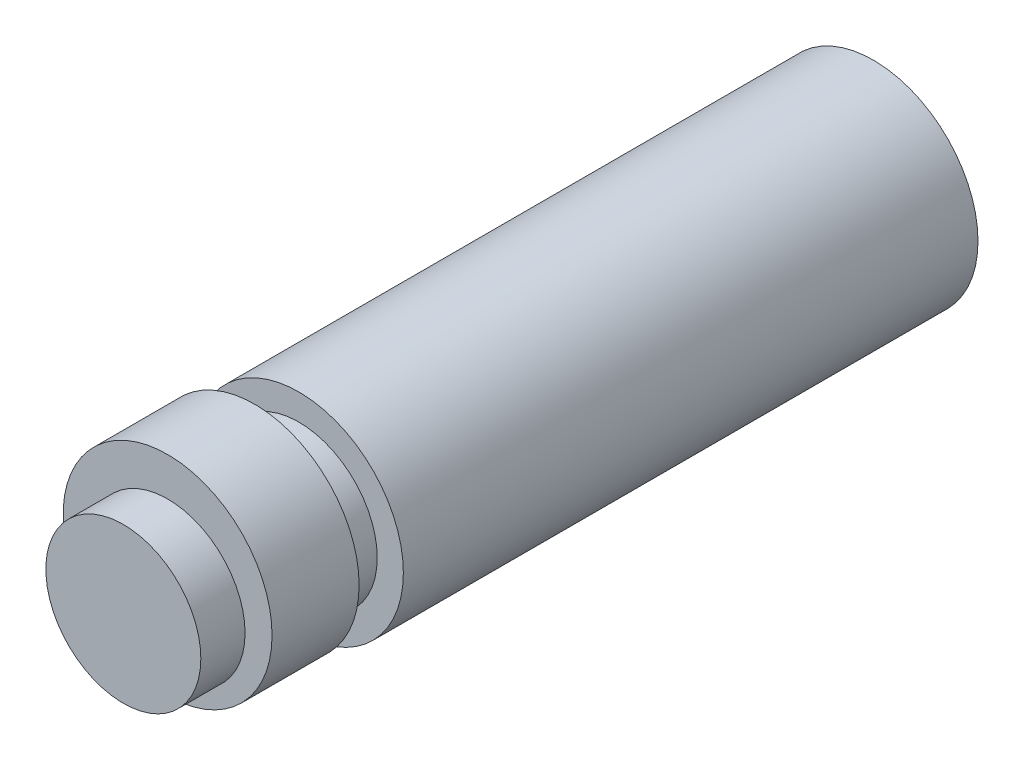
ISO-10303-21;
HEADER;
FILE_DESCRIPTION(('STEP AP214'),'2;1');
FILE_NAME('part.step','',(''),(''),'','','');
FILE_SCHEMA(('AUTOMOTIVE_DESIGN { 1 0 10303 214 1 1 1 1 }'));
ENDSEC;
DATA;
#1=APPLICATION_CONTEXT('core data for automotive mechanical design processes');
#2=APPLICATION_PROTOCOL_DEFINITION('international standard','automotive_design',2000,#1);
#3=PRODUCT_CONTEXT('',#1,'mechanical');
#4=PRODUCT('Part','Part','',(#3));
#5=PRODUCT_RELATED_PRODUCT_CATEGORY('part','',(#4));
#6=PRODUCT_DEFINITION_FORMATION('','',#4);
#7=PRODUCT_DEFINITION_CONTEXT('part definition',#1,'design');
#8=PRODUCT_DEFINITION('design','',#6,#7);
#9=PRODUCT_DEFINITION_SHAPE('','',#8);
#10=(LENGTH_UNIT() NAMED_UNIT(*) SI_UNIT(.MILLI.,.METRE.));
#11=(NAMED_UNIT(*) PLANE_ANGLE_UNIT() SI_UNIT($,.RADIAN.));
#12=(NAMED_UNIT(*) SI_UNIT($,.STERADIAN.) SOLID_ANGLE_UNIT());
#13=UNCERTAINTY_MEASURE_WITH_UNIT(LENGTH_MEASURE(1.E-05),#10,'distance_accuracy_value','');
#14=(GEOMETRIC_REPRESENTATION_CONTEXT(3) GLOBAL_UNCERTAINTY_ASSIGNED_CONTEXT((#13)) GLOBAL_UNIT_ASSIGNED_CONTEXT((#10,
#11,#12)) REPRESENTATION_CONTEXT('',''));
#15=CARTESIAN_POINT('',(0.,0.,0.));
#16=DIRECTION('',(0.,0.,1.));
#17=DIRECTION('',(1.,0.,0.));
#18=AXIS2_PLACEMENT_3D('',#15,#16,#17);
#19=CARTESIAN_POINT('',(0.,0.,0.));
#20=DIRECTION('',(0.,0.,1.));
#21=DIRECTION('',(1.,0.,0.));
#22=AXIS2_PLACEMENT_3D('',#19,#20,#21);
#23=PLANE('',#22);
#24=CARTESIAN_POINT('',(0.,0.,0.));
#25=DIRECTION('',(0.,0.,1.));
#26=DIRECTION('',(1.,0.,0.));
#27=AXIS2_PLACEMENT_3D('',#24,#25,#26);
#28=CIRCLE('',#27,6.);
#29=CARTESIAN_POINT('',(6.,0.,0.));
#30=VERTEX_POINT('',#29);
#31=EDGE_CURVE('E47',#30,#30,#28,.T.);
#32=ORIENTED_EDGE('',*,*,#31,.F.);
#33=EDGE_LOOP('',(#32));
#34=FACE_BOUND('',#33,.T.);
#35=DIRECTION('',(0.,1.,0.));
#36=VECTOR('',#35,1.);
#37=CARTESIAN_POINT('',(1.075,0.,0.));
#38=LINE('',#37,#36);
#39=CARTESIAN_POINT('',(1.075,3.98246155034797,0.));
#40=VERTEX_POINT('',#39);
#41=CARTESIAN_POINT('',(1.075,5.09246155034798,0.));
#42=VERTEX_POINT('',#41);
#43=EDGE_CURVE('E60',#40,#42,#38,.T.);
#44=ORIENTED_EDGE('',*,*,#43,.T.);
#45=DIRECTION('',(-1.,0.,0.));
#46=VECTOR('',#45,1.);
#47=CARTESIAN_POINT('',(0.,5.09246155034797,0.));
#48=LINE('',#47,#46);
#49=CARTESIAN_POINT('',(-1.075,5.09246155034797,0.));
#50=VERTEX_POINT('',#49);
#51=EDGE_CURVE('E86',#42,#50,#48,.T.);
#52=ORIENTED_EDGE('',*,*,#51,.T.);
#53=DIRECTION('',(0.,1.,0.));
#54=VECTOR('',#53,1.);
#55=CARTESIAN_POINT('',(-1.075,0.,0.));
#56=LINE('',#55,#54);
#57=CARTESIAN_POINT('',(-1.075,3.98246155034797,0.));
#58=VERTEX_POINT('',#57);
#59=EDGE_CURVE('E117',#58,#50,#56,.T.);
#60=ORIENTED_EDGE('',*,*,#59,.F.);
#61=CARTESIAN_POINT('',(0.,0.,0.));
#62=DIRECTION('',(0.,0.,-1.));
#63=DIRECTION('',(-1.,0.,0.));
#64=AXIS2_PLACEMENT_3D('',#61,#62,#63);
#65=CIRCLE('',#64,4.125);
#66=EDGE_CURVE('E99',#40,#58,#65,.T.);
#67=ORIENTED_EDGE('',*,*,#66,.F.);
#68=EDGE_LOOP('',(#44,#52,#60,#67));
#69=FACE_BOUND('',#68,.T.);
#70=ADVANCED_FACE('F43',(#34,#69),#23,.F.);
#71=CARTESIAN_POINT('',(0.,0.,33.));
#72=DIRECTION('',(0.,0.,-1.));
#73=DIRECTION('',(-1.,0.,0.));
#74=AXIS2_PLACEMENT_3D('',#71,#72,#73);
#75=CYLINDRICAL_SURFACE('',#74,6.);
#76=CARTESIAN_POINT('',(0.,0.,33.));
#77=DIRECTION('',(0.,0.,1.));
#78=DIRECTION('',(1.,0.,0.));
#79=AXIS2_PLACEMENT_3D('',#76,#77,#78);
#80=CIRCLE('',#79,6.);
#81=CARTESIAN_POINT('',(6.,0.,33.));
#82=VERTEX_POINT('',#81);
#83=EDGE_CURVE('E137',#82,#82,#80,.T.);
#84=ORIENTED_EDGE('',*,*,#83,.F.);
#85=EDGE_LOOP('',(#84));
#86=FACE_BOUND('',#85,.T.);
#87=ORIENTED_EDGE('',*,*,#31,.T.);
#88=EDGE_LOOP('',(#87));
#89=FACE_BOUND('',#88,.T.);
#90=ADVANCED_FACE('F45',(#86,#89),#75,.T.);
#91=CARTESIAN_POINT('',(0.,0.,33.));
#92=DIRECTION('',(0.,0.,1.));
#93=DIRECTION('',(1.,0.,0.));
#94=AXIS2_PLACEMENT_3D('',#91,#92,#93);
#95=PLANE('',#94);
#96=CARTESIAN_POINT('',(0.,0.,33.));
#97=DIRECTION('',(0.,0.,1.));
#98=DIRECTION('',(1.,0.,0.));
#99=AXIS2_PLACEMENT_3D('',#96,#97,#98);
#100=CIRCLE('',#99,4.5);
#101=CARTESIAN_POINT('',(4.5,0.,33.));
#102=VERTEX_POINT('',#101);
#103=EDGE_CURVE('E52',#102,#102,#100,.T.);
#104=ORIENTED_EDGE('',*,*,#103,.F.);
#105=EDGE_LOOP('',(#104));
#106=FACE_BOUND('',#105,.T.);
#107=ORIENTED_EDGE('',*,*,#83,.T.);
#108=EDGE_LOOP('',(#107));
#109=FACE_BOUND('',#108,.T.);
#110=ADVANCED_FACE('F152',(#106,#109),#95,.T.);
#111=CARTESIAN_POINT('',(0.,0.,35.54));
#112=DIRECTION('',(0.,0.,-1.));
#113=DIRECTION('',(-1.,0.,0.));
#114=AXIS2_PLACEMENT_3D('',#111,#112,#113);
#115=CYLINDRICAL_SURFACE('',#114,4.5);
#116=CARTESIAN_POINT('',(0.,0.,35.54));
#117=DIRECTION('',(0.,0.,1.));
#118=DIRECTION('',(1.,0.,0.));
#119=AXIS2_PLACEMENT_3D('',#116,#117,#118);
#120=CIRCLE('',#119,4.5);
#121=CARTESIAN_POINT('',(4.5,0.,35.54));
#122=VERTEX_POINT('',#121);
#123=EDGE_CURVE('E131',#122,#122,#120,.T.);
#124=ORIENTED_EDGE('',*,*,#123,.F.);
#125=EDGE_LOOP('',(#124));
#126=FACE_BOUND('',#125,.T.);
#127=ORIENTED_EDGE('',*,*,#103,.T.);
#128=EDGE_LOOP('',(#127));
#129=FACE_BOUND('',#128,.T.);
#130=ADVANCED_FACE('F157',(#126,#129),#115,.T.);
#131=CARTESIAN_POINT('',(0.,0.6604,40.54));
#132=DIRECTION('',(0.,0.,-1.));
#133=DIRECTION('',(-1.,0.,0.));
#134=AXIS2_PLACEMENT_3D('',#131,#132,#133);
#135=CYLINDRICAL_SURFACE('',#134,6.);
#136=CARTESIAN_POINT('',(0.,0.6604,40.54));
#137=DIRECTION('',(0.,0.,1.));
#138=DIRECTION('',(1.,0.,0.));
#139=AXIS2_PLACEMENT_3D('',#136,#137,#138);
#140=CIRCLE('',#139,6.);
#141=CARTESIAN_POINT('',(6.,0.6604,40.54));
#142=VERTEX_POINT('',#141);
#143=EDGE_CURVE('E128',#142,#142,#140,.T.);
#144=ORIENTED_EDGE('',*,*,#143,.F.);
#145=EDGE_LOOP('',(#144));
#146=FACE_BOUND('',#145,.T.);
#147=CARTESIAN_POINT('',(0.,0.6604,35.54));
#148=DIRECTION('',(0.,0.,1.));
#149=DIRECTION('',(1.,0.,0.));
#150=AXIS2_PLACEMENT_3D('',#147,#148,#149);
#151=CIRCLE('',#150,6.);
#152=CARTESIAN_POINT('',(6.,0.6604,35.54));
#153=VERTEX_POINT('',#152);
#154=EDGE_CURVE('E126',#153,#153,#151,.T.);
#155=ORIENTED_EDGE('',*,*,#154,.T.);
#156=EDGE_LOOP('',(#155));
#157=FACE_BOUND('',#156,.T.);
#158=ADVANCED_FACE('F161',(#146,#157),#135,.T.);
#159=CARTESIAN_POINT('',(0.,0.,40.54));
#160=DIRECTION('',(0.,0.,1.));
#161=DIRECTION('',(1.,0.,0.));
#162=AXIS2_PLACEMENT_3D('',#159,#160,#161);
#163=PLANE('',#162);
#164=CARTESIAN_POINT('',(0.,0.,40.54));
#165=DIRECTION('',(0.,0.,1.));
#166=DIRECTION('',(1.,0.,0.));
#167=AXIS2_PLACEMENT_3D('',#164,#165,#166);
#168=CIRCLE('',#167,4.45);
#169=CARTESIAN_POINT('',(4.45,0.,40.54));
#170=VERTEX_POINT('',#169);
#171=EDGE_CURVE('E11',#170,#170,#168,.T.);
#172=ORIENTED_EDGE('',*,*,#171,.F.);
#173=EDGE_LOOP('',(#172));
#174=FACE_BOUND('',#173,.T.);
#175=ORIENTED_EDGE('',*,*,#143,.T.);
#176=EDGE_LOOP('',(#175));
#177=FACE_BOUND('',#176,.T.);
#178=ADVANCED_FACE('F165',(#174,#177),#163,.T.);
#179=CARTESIAN_POINT('',(0.,0.,35.54));
#180=DIRECTION('',(0.,0.,1.));
#181=DIRECTION('',(1.,0.,0.));
#182=AXIS2_PLACEMENT_3D('',#179,#180,#181);
#183=PLANE('',#182);
#184=ORIENTED_EDGE('',*,*,#123,.T.);
#185=EDGE_LOOP('',(#184));
#186=FACE_BOUND('',#185,.T.);
#187=ORIENTED_EDGE('',*,*,#154,.F.);
#188=EDGE_LOOP('',(#187));
#189=FACE_BOUND('',#188,.T.);
#190=ADVANCED_FACE('F167',(#186,#189),#183,.F.);
#191=CARTESIAN_POINT('',(0.,0.,43.08));
#192=DIRECTION('',(0.,0.,-1.));
#193=DIRECTION('',(-1.,0.,0.));
#194=AXIS2_PLACEMENT_3D('',#191,#192,#193);
#195=CYLINDRICAL_SURFACE('',#194,4.45);
#196=CARTESIAN_POINT('',(0.,0.,43.08));
#197=DIRECTION('',(0.,0.,1.));
#198=DIRECTION('',(1.,0.,0.));
#199=AXIS2_PLACEMENT_3D('',#196,#197,#198);
#200=CIRCLE('',#199,4.45);
#201=CARTESIAN_POINT('',(4.45,0.,43.08));
#202=VERTEX_POINT('',#201);
#203=EDGE_CURVE('E122',#202,#202,#200,.T.);
#204=ORIENTED_EDGE('',*,*,#203,.F.);
#205=EDGE_LOOP('',(#204));
#206=FACE_BOUND('',#205,.T.);
#207=ORIENTED_EDGE('',*,*,#171,.T.);
#208=EDGE_LOOP('',(#207));
#209=FACE_BOUND('',#208,.T.);
#210=ADVANCED_FACE('F170',(#206,#209),#195,.T.);
#211=CARTESIAN_POINT('',(0.,0.,43.08));
#212=DIRECTION('',(0.,0.,1.));
#213=DIRECTION('',(1.,0.,0.));
#214=AXIS2_PLACEMENT_3D('',#211,#212,#213);
#215=PLANE('',#214);
#216=ORIENTED_EDGE('',*,*,#203,.T.);
#217=EDGE_LOOP('',(#216));
#218=FACE_BOUND('',#217,.T.);
#219=ADVANCED_FACE('F177',(#218),#215,.T.);
#220=CARTESIAN_POINT('',(1.075,0.,31.5));
#221=DIRECTION('',(-1.,0.,0.));
#222=DIRECTION('',(0.,0.,1.));
#223=AXIS2_PLACEMENT_3D('',#220,#221,#222);
#224=PLANE('',#223);
#225=ORIENTED_EDGE('',*,*,#43,.F.);
#226=DIRECTION('',(0.,0.,-1.));
#227=VECTOR('',#226,1.);
#228=CARTESIAN_POINT('',(1.075,3.98246155034797,31.5));
#229=LINE('',#228,#227);
#230=CARTESIAN_POINT('',(1.075,3.98246155034797,31.5));
#231=VERTEX_POINT('',#230);
#232=EDGE_CURVE('E88',#231,#40,#229,.T.);
#233=ORIENTED_EDGE('',*,*,#232,.F.);
#234=DIRECTION('',(0.,1.,0.));
#235=VECTOR('',#234,1.);
#236=CARTESIAN_POINT('',(1.075,0.,31.5));
#237=LINE('',#236,#235);
#238=CARTESIAN_POINT('',(1.075,5.09246155034798,31.5));
#239=VERTEX_POINT('',#238);
#240=EDGE_CURVE('E110',#231,#239,#237,.T.);
#241=ORIENTED_EDGE('',*,*,#240,.T.);
#242=DIRECTION('',(0.,0.,-1.));
#243=VECTOR('',#242,1.);
#244=CARTESIAN_POINT('',(1.075,5.09246155034798,31.5));
#245=LINE('',#244,#243);
#246=EDGE_CURVE('E120',#239,#42,#245,.T.);
#247=ORIENTED_EDGE('',*,*,#246,.T.);
#248=EDGE_LOOP('',(#225,#233,#241,#247));
#249=FACE_BOUND('',#248,.T.);
#250=ADVANCED_FACE('F180',(#249),#224,.T.);
#251=CARTESIAN_POINT('',(0.,5.09246155034797,31.5));
#252=DIRECTION('',(0.,-1.,0.));
#253=DIRECTION('',(1.,0.,0.));
#254=AXIS2_PLACEMENT_3D('',#251,#252,#253);
#255=PLANE('',#254);
#256=ORIENTED_EDGE('',*,*,#51,.F.);
#257=ORIENTED_EDGE('',*,*,#246,.F.);
#258=DIRECTION('',(-1.,0.,0.));
#259=VECTOR('',#258,1.);
#260=CARTESIAN_POINT('',(0.,5.09246155034797,31.5));
#261=LINE('',#260,#259);
#262=CARTESIAN_POINT('',(-1.075,5.09246155034797,31.5));
#263=VERTEX_POINT('',#262);
#264=EDGE_CURVE('E69',#239,#263,#261,.T.);
#265=ORIENTED_EDGE('',*,*,#264,.T.);
#266=DIRECTION('',(0.,0.,-1.));
#267=VECTOR('',#266,1.);
#268=CARTESIAN_POINT('',(-1.075,5.09246155034797,31.5));
#269=LINE('',#268,#267);
#270=EDGE_CURVE('E103',#263,#50,#269,.T.);
#271=ORIENTED_EDGE('',*,*,#270,.T.);
#272=EDGE_LOOP('',(#256,#257,#265,#271));
#273=FACE_BOUND('',#272,.T.);
#274=ADVANCED_FACE('F183',(#273),#255,.T.);
#275=CARTESIAN_POINT('',(-1.075,0.,31.5));
#276=DIRECTION('',(-1.,0.,0.));
#277=DIRECTION('',(0.,0.,1.));
#278=AXIS2_PLACEMENT_3D('',#275,#276,#277);
#279=PLANE('',#278);
#280=ORIENTED_EDGE('',*,*,#59,.T.);
#281=ORIENTED_EDGE('',*,*,#270,.F.);
#282=DIRECTION('',(0.,1.,0.));
#283=VECTOR('',#282,1.);
#284=CARTESIAN_POINT('',(-1.075,0.,31.5));
#285=LINE('',#284,#283);
#286=CARTESIAN_POINT('',(-1.075,3.98246155034797,31.5));
#287=VERTEX_POINT('',#286);
#288=EDGE_CURVE('E106',#287,#263,#285,.T.);
#289=ORIENTED_EDGE('',*,*,#288,.F.);
#290=DIRECTION('',(0.,0.,-1.));
#291=VECTOR('',#290,1.);
#292=CARTESIAN_POINT('',(-1.075,3.98246155034797,31.5));
#293=LINE('',#292,#291);
#294=EDGE_CURVE('E93',#287,#58,#293,.T.);
#295=ORIENTED_EDGE('',*,*,#294,.T.);
#296=EDGE_LOOP('',(#280,#281,#289,#295));
#297=FACE_BOUND('',#296,.T.);
#298=ADVANCED_FACE('F107',(#297),#279,.F.);
#299=CARTESIAN_POINT('',(0.,0.,31.5));
#300=DIRECTION('',(0.,0.,-1.));
#301=DIRECTION('',(-1.,0.,0.));
#302=AXIS2_PLACEMENT_3D('',#299,#300,#301);
#303=CYLINDRICAL_SURFACE('',#302,4.125);
#304=ORIENTED_EDGE('',*,*,#66,.T.);
#305=ORIENTED_EDGE('',*,*,#294,.F.);
#306=CARTESIAN_POINT('',(0.,0.,31.5));
#307=DIRECTION('',(0.,0.,-1.));
#308=DIRECTION('',(-1.,0.,0.));
#309=AXIS2_PLACEMENT_3D('',#306,#307,#308);
#310=CIRCLE('',#309,4.125);
#311=EDGE_CURVE('E97',#231,#287,#310,.T.);
#312=ORIENTED_EDGE('',*,*,#311,.F.);
#313=ORIENTED_EDGE('',*,*,#232,.T.);
#314=EDGE_LOOP('',(#304,#305,#312,#313));
#315=FACE_BOUND('',#314,.T.);
#316=ADVANCED_FACE('F95',(#315),#303,.F.);
#317=CARTESIAN_POINT('',(0.,0.,31.5));
#318=DIRECTION('',(0.,0.,-1.));
#319=DIRECTION('',(-1.,0.,0.));
#320=AXIS2_PLACEMENT_3D('',#317,#318,#319);
#321=PLANE('',#320);
#322=ORIENTED_EDGE('',*,*,#240,.F.);
#323=ORIENTED_EDGE('',*,*,#311,.T.);
#324=ORIENTED_EDGE('',*,*,#288,.T.);
#325=ORIENTED_EDGE('',*,*,#264,.F.);
#326=EDGE_LOOP('',(#322,#323,#324,#325));
#327=FACE_BOUND('',#326,.T.);
#328=ADVANCED_FACE('F109',(#327),#321,.T.);
#329=CLOSED_SHELL('',(#70,#90,#110,#130,#158,#178,#190,#210,#219,#250,#274,#298,#316,#328));
#330=MANIFOLD_SOLID_BREP('B2',#329);
#331=ADVANCED_BREP_SHAPE_REPRESENTATION('',(#18,#330),#14);
#332=SHAPE_DEFINITION_REPRESENTATION(#9,#331);
ENDSEC;
END-ISO-10303-21;
